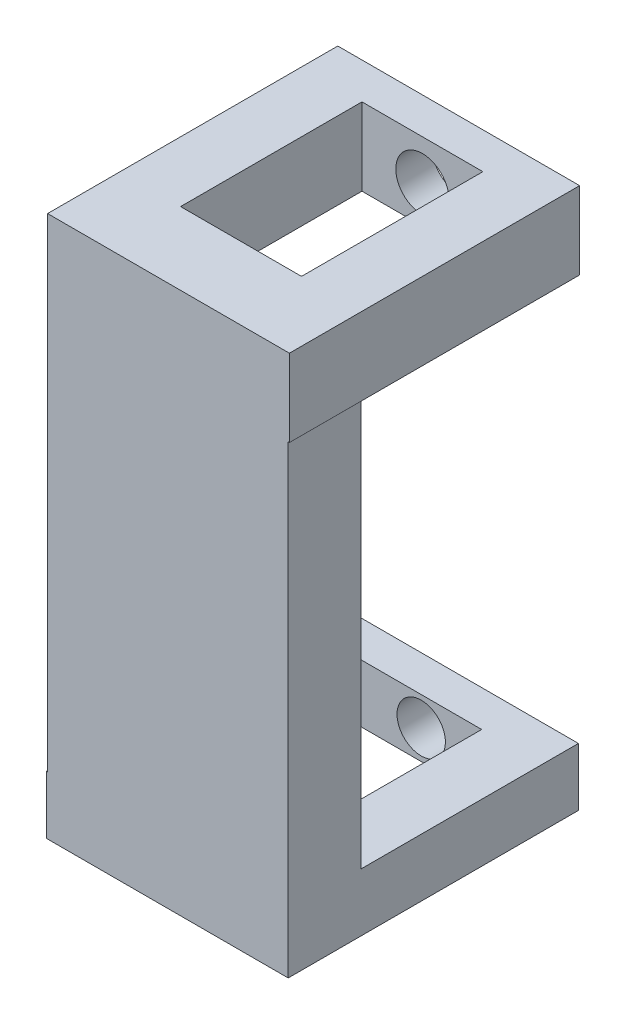
ISO-10303-21;
HEADER;
FILE_DESCRIPTION(('STEP AP214'),'2;1');
FILE_NAME('part.step','',(''),(''),'','','');
FILE_SCHEMA(('AUTOMOTIVE_DESIGN { 1 0 10303 214 1 1 1 1 }'));
ENDSEC;
DATA;
#1=APPLICATION_CONTEXT('core data for automotive mechanical design processes');
#2=APPLICATION_PROTOCOL_DEFINITION('international standard','automotive_design',2000,#1);
#3=PRODUCT_CONTEXT('',#1,'mechanical');
#4=PRODUCT('Part','Part','',(#3));
#5=PRODUCT_RELATED_PRODUCT_CATEGORY('part','',(#4));
#6=PRODUCT_DEFINITION_FORMATION('','',#4);
#7=PRODUCT_DEFINITION_CONTEXT('part definition',#1,'design');
#8=PRODUCT_DEFINITION('design','',#6,#7);
#9=PRODUCT_DEFINITION_SHAPE('','',#8);
#10=(LENGTH_UNIT() NAMED_UNIT(*) SI_UNIT(.MILLI.,.METRE.));
#11=(NAMED_UNIT(*) PLANE_ANGLE_UNIT() SI_UNIT($,.RADIAN.));
#12=(NAMED_UNIT(*) SI_UNIT($,.STERADIAN.) SOLID_ANGLE_UNIT());
#13=UNCERTAINTY_MEASURE_WITH_UNIT(LENGTH_MEASURE(1.E-05),#10,'distance_accuracy_value','');
#14=(GEOMETRIC_REPRESENTATION_CONTEXT(3) GLOBAL_UNCERTAINTY_ASSIGNED_CONTEXT((#13)) GLOBAL_UNIT_ASSIGNED_CONTEXT((#10,
#11,#12)) REPRESENTATION_CONTEXT('',''));
#15=CARTESIAN_POINT('',(0.,0.,0.));
#16=DIRECTION('',(0.,0.,1.));
#17=DIRECTION('',(1.,0.,0.));
#18=AXIS2_PLACEMENT_3D('',#15,#16,#17);
#19=CARTESIAN_POINT('',(-19.9235312164194,-0.0744955401104435,170.832884641977));
#20=DIRECTION('',(1.,0.,0.));
#21=DIRECTION('',(0.,0.,-1.));
#22=AXIS2_PLACEMENT_3D('',#19,#20,#21);
#23=PLANE('',#22);
#24=DIRECTION('',(0.,0.,-1.));
#25=VECTOR('',#24,1.);
#26=CARTESIAN_POINT('',(-19.9235312164194,-20.0742558801104,170.832884641977));
#27=LINE('',#26,#25);
#28=CARTESIAN_POINT('',(-19.9235312164194,-20.0742558801104,170.832884641977));
#29=VERTEX_POINT('',#28);
#30=CARTESIAN_POINT('',(-19.9235312164194,-20.0742558801104,167.832884641977));
#31=VERTEX_POINT('',#30);
#32=EDGE_CURVE('E47',#29,#31,#27,.T.);
#33=ORIENTED_EDGE('',*,*,#32,.F.);
#34=DIRECTION('',(0.,-1.,0.));
#35=VECTOR('',#34,1.);
#36=CARTESIAN_POINT('',(-19.9235312164194,-0.0744955401104435,170.832884641977));
#37=LINE('',#36,#35);
#38=CARTESIAN_POINT('',(-19.9235312164194,-0.0744955401104435,170.832884641977));
#39=VERTEX_POINT('',#38);
#40=EDGE_CURVE('E277',#39,#29,#37,.T.);
#41=ORIENTED_EDGE('',*,*,#40,.F.);
#42=DIRECTION('',(0.,0.,-1.));
#43=VECTOR('',#42,1.);
#44=CARTESIAN_POINT('',(-19.9235312164194,-0.0744955401104435,170.832884641977));
#45=LINE('',#44,#43);
#46=CARTESIAN_POINT('',(-19.9235312164194,-0.0744955401104435,158.832884641977));
#47=VERTEX_POINT('',#46);
#48=EDGE_CURVE('E286',#39,#47,#45,.T.);
#49=ORIENTED_EDGE('',*,*,#48,.T.);
#50=DIRECTION('',(0.,-1.,0.));
#51=VECTOR('',#50,1.);
#52=CARTESIAN_POINT('',(-19.9235312164194,-0.0744955401104435,158.832884641977));
#53=LINE('',#52,#51);
#54=CARTESIAN_POINT('',(-19.9235312164194,-3.27449554011044,158.832884641977));
#55=VERTEX_POINT('',#54);
#56=EDGE_CURVE('E276',#47,#55,#53,.T.);
#57=ORIENTED_EDGE('',*,*,#56,.T.);
#58=DIRECTION('',(0.,0.,-1.));
#59=VECTOR('',#58,1.);
#60=CARTESIAN_POINT('',(-19.9235312164194,-3.27449554011044,170.832884641977));
#61=LINE('',#60,#59);
#62=CARTESIAN_POINT('',(-19.9235312164194,-3.27449554011044,167.832884641977));
#63=VERTEX_POINT('',#62);
#64=EDGE_CURVE('E302',#63,#55,#61,.T.);
#65=ORIENTED_EDGE('',*,*,#64,.F.);
#66=DIRECTION('',(0.,-1.,0.));
#67=VECTOR('',#66,1.);
#68=CARTESIAN_POINT('',(-19.9235312164194,-0.0744955401104435,167.832884641977));
#69=LINE('',#68,#67);
#70=EDGE_CURVE('E224',#63,#31,#69,.T.);
#71=ORIENTED_EDGE('',*,*,#70,.T.);
#72=EDGE_LOOP('',(#33,#41,#49,#57,#65,#71));
#73=FACE_BOUND('',#72,.T.);
#74=ADVANCED_FACE('F33',(#73),#23,.F.);
#75=CARTESIAN_POINT('',(0.,0.,167.832884641977));
#76=DIRECTION('',(0.,0.,1.));
#77=DIRECTION('',(1.,0.,0.));
#78=AXIS2_PLACEMENT_3D('',#75,#76,#77);
#79=PLANE('',#78);
#80=DIRECTION('',(1.,0.,0.));
#81=VECTOR('',#80,1.);
#82=CARTESIAN_POINT('',(0.,-20.0742558801104,167.832884641977));
#83=LINE('',#82,#81);
#84=CARTESIAN_POINT('',(-12.4733202964194,-20.0742558801104,167.832884641977));
#85=VERTEX_POINT('',#84);
#86=CARTESIAN_POINT('',(-9.97332029641936,-20.0742558801104,167.832884641977));
#87=VERTEX_POINT('',#86);
#88=EDGE_CURVE('E11',#85,#87,#83,.T.);
#89=ORIENTED_EDGE('',*,*,#88,.F.);
#90=DIRECTION('',(0.,1.,0.));
#91=VECTOR('',#90,1.);
#92=CARTESIAN_POINT('',(-12.4733202964194,0.,167.832884641977));
#93=LINE('',#92,#91);
#94=CARTESIAN_POINT('',(-12.4733202964194,-22.4742565801104,167.832884641977));
#95=VERTEX_POINT('',#94);
#96=EDGE_CURVE('E219',#95,#85,#93,.T.);
#97=ORIENTED_EDGE('',*,*,#96,.F.);
#98=DIRECTION('',(1.,0.,0.));
#99=VECTOR('',#98,1.);
#100=CARTESIAN_POINT('',(-19.9235312164194,-22.4742565801104,167.832884641977));
#101=LINE('',#100,#99);
#102=CARTESIAN_POINT('',(-17.4733202964194,-22.4742565801104,167.832884641977));
#103=VERTEX_POINT('',#102);
#104=EDGE_CURVE('E226',#103,#95,#101,.T.);
#105=ORIENTED_EDGE('',*,*,#104,.F.);
#106=DIRECTION('',(0.,-1.,0.));
#107=VECTOR('',#106,1.);
#108=CARTESIAN_POINT('',(-17.4733202964194,0.,167.832884641977));
#109=LINE('',#108,#107);
#110=CARTESIAN_POINT('',(-17.4733202964194,-20.0742558801104,167.832884641977));
#111=VERTEX_POINT('',#110);
#112=EDGE_CURVE('E55',#111,#103,#109,.T.);
#113=ORIENTED_EDGE('',*,*,#112,.F.);
#114=EDGE_CURVE('E36',#31,#111,#83,.T.);
#115=ORIENTED_EDGE('',*,*,#114,.F.);
#116=ORIENTED_EDGE('',*,*,#70,.F.);
#117=DIRECTION('',(1.,0.,0.));
#118=VECTOR('',#117,1.);
#119=CARTESIAN_POINT('',(-19.9235312164194,-3.27449554011044,167.832884641977));
#120=LINE('',#119,#118);
#121=CARTESIAN_POINT('',(-17.4235312164194,-3.27449554011044,167.832884641977));
#122=VERTEX_POINT('',#121);
#123=EDGE_CURVE('E240',#63,#122,#120,.T.);
#124=ORIENTED_EDGE('',*,*,#123,.T.);
#125=DIRECTION('',(0.,1.,0.));
#126=VECTOR('',#125,1.);
#127=CARTESIAN_POINT('',(-17.4235312164194,-0.0744955401104441,167.832884641977));
#128=LINE('',#127,#126);
#129=CARTESIAN_POINT('',(-17.4235312164194,-0.0744955401104441,167.832884641977));
#130=VERTEX_POINT('',#129);
#131=EDGE_CURVE('E304',#122,#130,#128,.T.);
#132=ORIENTED_EDGE('',*,*,#131,.T.);
#133=DIRECTION('',(-1.,0.,0.));
#134=VECTOR('',#133,1.);
#135=CARTESIAN_POINT('',(-19.9235312164194,-0.0744955401104435,167.832884641977));
#136=LINE('',#135,#134);
#137=CARTESIAN_POINT('',(-12.4235312164194,-0.0744955401104435,167.832884641977));
#138=VERTEX_POINT('',#137);
#139=EDGE_CURVE('E232',#138,#130,#136,.T.);
#140=ORIENTED_EDGE('',*,*,#139,.F.);
#141=DIRECTION('',(0.,-1.,0.));
#142=VECTOR('',#141,1.);
#143=CARTESIAN_POINT('',(-12.4235312164194,-0.0744955401104435,167.832884641977));
#144=LINE('',#143,#142);
#145=CARTESIAN_POINT('',(-12.4235312164194,-3.27449554011044,167.832884641977));
#146=VERTEX_POINT('',#145);
#147=EDGE_CURVE('E243',#138,#146,#144,.T.);
#148=ORIENTED_EDGE('',*,*,#147,.T.);
#149=CARTESIAN_POINT('',(-9.97332029641936,-3.27449554011044,167.832884641977));
#150=VERTEX_POINT('',#149);
#151=EDGE_CURVE('E244',#146,#150,#120,.T.);
#152=ORIENTED_EDGE('',*,*,#151,.T.);
#153=DIRECTION('',(0.,1.,0.));
#154=VECTOR('',#153,1.);
#155=CARTESIAN_POINT('',(-9.97332029641937,-0.0744955401104435,167.832884641977));
#156=LINE('',#155,#154);
#157=EDGE_CURVE('E230',#87,#150,#156,.T.);
#158=ORIENTED_EDGE('',*,*,#157,.F.);
#159=EDGE_LOOP('',(#89,#97,#105,#113,#115,#116,#124,#132,#140,#148,#152,#158));
#160=FACE_BOUND('',#159,.T.);
#161=ADVANCED_FACE('F308',(#160),#79,.F.);
#162=CARTESIAN_POINT('',(-19.9235312164194,-3.27449554011044,170.832884641977));
#163=DIRECTION('',(0.,1.,0.));
#164=DIRECTION('',(0.,0.,1.));
#165=AXIS2_PLACEMENT_3D('',#162,#163,#164);
#166=PLANE('',#165);
#167=ORIENTED_EDGE('',*,*,#123,.F.);
#168=ORIENTED_EDGE('',*,*,#64,.T.);
#169=DIRECTION('',(1.,0.,0.));
#170=VECTOR('',#169,1.);
#171=CARTESIAN_POINT('',(-19.9235312164194,-3.27449554011044,158.832884641977));
#172=LINE('',#171,#170);
#173=CARTESIAN_POINT('',(-9.92353121641937,-3.27449554011044,158.832884641977));
#174=VERTEX_POINT('',#173);
#175=EDGE_CURVE('E289',#55,#174,#172,.T.);
#176=ORIENTED_EDGE('',*,*,#175,.T.);
#177=DIRECTION('',(0.,0.,-1.));
#178=VECTOR('',#177,1.);
#179=CARTESIAN_POINT('',(-9.92353121641937,-3.27449554011044,170.832884641977));
#180=LINE('',#179,#178);
#181=CARTESIAN_POINT('',(-9.92353121641937,-3.27449554011044,170.832884641977));
#182=VERTEX_POINT('',#181);
#183=EDGE_CURVE('E299',#182,#174,#180,.T.);
#184=ORIENTED_EDGE('',*,*,#183,.F.);
#185=DIRECTION('',(1.,0.,0.));
#186=VECTOR('',#185,1.);
#187=CARTESIAN_POINT('',(-19.9235312164194,-3.27449554011044,170.832884641977));
#188=LINE('',#187,#186);
#189=CARTESIAN_POINT('',(-9.97332029641936,-3.27449554011044,170.832884641977));
#190=VERTEX_POINT('',#189);
#191=EDGE_CURVE('E279',#190,#182,#188,.T.);
#192=ORIENTED_EDGE('',*,*,#191,.F.);
#193=DIRECTION('',(0.,0.,-1.));
#194=VECTOR('',#193,1.);
#195=CARTESIAN_POINT('',(-9.97332029641937,-3.27449554011044,170.832884641977));
#196=LINE('',#195,#194);
#197=EDGE_CURVE('E247',#190,#150,#196,.T.);
#198=ORIENTED_EDGE('',*,*,#197,.T.);
#199=ORIENTED_EDGE('',*,*,#151,.F.);
#200=DIRECTION('',(0.,0.,1.));
#201=VECTOR('',#200,1.);
#202=CARTESIAN_POINT('',(-12.4235312164194,-3.27449554011044,160.332884641977));
#203=LINE('',#202,#201);
#204=CARTESIAN_POINT('',(-12.4235312164194,-3.27449554011044,160.332884641977));
#205=VERTEX_POINT('',#204);
#206=EDGE_CURVE('E262',#205,#146,#203,.T.);
#207=ORIENTED_EDGE('',*,*,#206,.F.);
#208=DIRECTION('',(1.,0.,0.));
#209=VECTOR('',#208,1.);
#210=CARTESIAN_POINT('',(-12.4235312164194,-3.27449554011044,160.332884641977));
#211=LINE('',#210,#209);
#212=CARTESIAN_POINT('',(-17.4235312164194,-3.27449554011044,160.332884641977));
#213=VERTEX_POINT('',#212);
#214=EDGE_CURVE('E258',#213,#205,#211,.T.);
#215=ORIENTED_EDGE('',*,*,#214,.F.);
#216=DIRECTION('',(0.,0.,1.));
#217=VECTOR('',#216,1.);
#218=CARTESIAN_POINT('',(-17.4235312164194,-3.27449554011044,160.332884641977));
#219=LINE('',#218,#217);
#220=EDGE_CURVE('E266',#213,#122,#219,.T.);
#221=ORIENTED_EDGE('',*,*,#220,.T.);
#222=EDGE_LOOP('',(#167,#168,#176,#184,#192,#198,#199,#207,#215,#221));
#223=FACE_BOUND('',#222,.T.);
#224=ADVANCED_FACE('F321',(#223),#166,.F.);
#225=CARTESIAN_POINT('',(-12.4235312164194,-0.0744955401104435,160.332884641977));
#226=DIRECTION('',(1.,0.,0.));
#227=DIRECTION('',(0.,0.,-1.));
#228=AXIS2_PLACEMENT_3D('',#225,#226,#227);
#229=PLANE('',#228);
#230=ORIENTED_EDGE('',*,*,#147,.F.);
#231=DIRECTION('',(0.,0.,1.));
#232=VECTOR('',#231,1.);
#233=CARTESIAN_POINT('',(-12.4235312164194,-0.0744955401104435,160.332884641977));
#234=LINE('',#233,#232);
#235=CARTESIAN_POINT('',(-12.4235312164194,-0.0744955401104435,160.332884641977));
#236=VERTEX_POINT('',#235);
#237=EDGE_CURVE('E261',#236,#138,#234,.T.);
#238=ORIENTED_EDGE('',*,*,#237,.F.);
#239=DIRECTION('',(0.,1.,0.));
#240=VECTOR('',#239,1.);
#241=CARTESIAN_POINT('',(-12.4235312164194,-0.0744955401104435,160.332884641977));
#242=LINE('',#241,#240);
#243=EDGE_CURVE('E250',#205,#236,#242,.T.);
#244=ORIENTED_EDGE('',*,*,#243,.F.);
#245=ORIENTED_EDGE('',*,*,#206,.T.);
#246=EDGE_LOOP('',(#230,#238,#244,#245));
#247=FACE_BOUND('',#246,.T.);
#248=ADVANCED_FACE('F317',(#247),#229,.F.);
#249=CARTESIAN_POINT('',(-17.4235312164194,-0.0744955401104441,160.332884641977));
#250=DIRECTION('',(-1.,0.,0.));
#251=DIRECTION('',(0.,0.,1.));
#252=AXIS2_PLACEMENT_3D('',#249,#250,#251);
#253=PLANE('',#252);
#254=ORIENTED_EDGE('',*,*,#131,.F.);
#255=ORIENTED_EDGE('',*,*,#220,.F.);
#256=DIRECTION('',(0.,-1.,0.));
#257=VECTOR('',#256,1.);
#258=CARTESIAN_POINT('',(-17.4235312164194,-0.0744955401104441,160.332884641977));
#259=LINE('',#258,#257);
#260=CARTESIAN_POINT('',(-17.4235312164194,-0.0744955401104441,160.332884641977));
#261=VERTEX_POINT('',#260);
#262=EDGE_CURVE('E255',#261,#213,#259,.T.);
#263=ORIENTED_EDGE('',*,*,#262,.F.);
#264=DIRECTION('',(0.,0.,1.));
#265=VECTOR('',#264,1.);
#266=CARTESIAN_POINT('',(-17.4235312164194,-0.0744955401104441,160.332884641977));
#267=LINE('',#266,#265);
#268=EDGE_CURVE('E269',#261,#130,#267,.T.);
#269=ORIENTED_EDGE('',*,*,#268,.T.);
#270=EDGE_LOOP('',(#254,#255,#263,#269));
#271=FACE_BOUND('',#270,.T.);
#272=ADVANCED_FACE('F448',(#271),#253,.F.);
#273=CARTESIAN_POINT('',(0.,0.,170.832884641977));
#274=DIRECTION('',(0.,0.,1.));
#275=DIRECTION('',(1.,0.,0.));
#276=AXIS2_PLACEMENT_3D('',#273,#274,#275);
#277=PLANE('',#276);
#278=DIRECTION('',(0.,1.,0.));
#279=VECTOR('',#278,1.);
#280=CARTESIAN_POINT('',(-9.97332029641937,-0.0744955401104435,170.832884641977));
#281=LINE('',#280,#279);
#282=CARTESIAN_POINT('',(-9.97332029641936,-22.4742565801104,170.832884641977));
#283=VERTEX_POINT('',#282);
#284=EDGE_CURVE('E227',#283,#190,#281,.T.);
#285=ORIENTED_EDGE('',*,*,#284,.T.);
#286=ORIENTED_EDGE('',*,*,#191,.T.);
#287=DIRECTION('',(0.,1.,0.));
#288=VECTOR('',#287,1.);
#289=CARTESIAN_POINT('',(-9.92353121641937,-0.0744955401104435,170.832884641977));
#290=LINE('',#289,#288);
#291=CARTESIAN_POINT('',(-9.92353121641937,-0.0744955401104435,170.832884641977));
#292=VERTEX_POINT('',#291);
#293=EDGE_CURVE('E282',#182,#292,#290,.T.);
#294=ORIENTED_EDGE('',*,*,#293,.T.);
#295=DIRECTION('',(-1.,0.,0.));
#296=VECTOR('',#295,1.);
#297=CARTESIAN_POINT('',(-19.9235312164194,-0.0744955401104435,170.832884641977));
#298=LINE('',#297,#296);
#299=EDGE_CURVE('E284',#292,#39,#298,.T.);
#300=ORIENTED_EDGE('',*,*,#299,.T.);
#301=ORIENTED_EDGE('',*,*,#40,.T.);
#302=DIRECTION('',(-1.,0.,0.));
#303=VECTOR('',#302,1.);
#304=CARTESIAN_POINT('',(-19.9733202964194,-20.0742558801104,170.832884641977));
#305=LINE('',#304,#303);
#306=CARTESIAN_POINT('',(-19.9733202964194,-20.0742558801104,170.832884641977));
#307=VERTEX_POINT('',#306);
#308=EDGE_CURVE('E196',#29,#307,#305,.T.);
#309=ORIENTED_EDGE('',*,*,#308,.T.);
#310=DIRECTION('',(0.,-1.,0.));
#311=VECTOR('',#310,1.);
#312=CARTESIAN_POINT('',(-19.9733202964194,-20.0742558801104,170.832884641977));
#313=LINE('',#312,#311);
#314=CARTESIAN_POINT('',(-19.9733202964194,-22.4742565801104,170.832884641977));
#315=VERTEX_POINT('',#314);
#316=EDGE_CURVE('E193',#307,#315,#313,.T.);
#317=ORIENTED_EDGE('',*,*,#316,.T.);
#318=DIRECTION('',(1.,0.,0.));
#319=VECTOR('',#318,1.);
#320=CARTESIAN_POINT('',(-19.9235312164194,-22.4742565801104,170.832884641977));
#321=LINE('',#320,#319);
#322=EDGE_CURVE('E223',#315,#283,#321,.T.);
#323=ORIENTED_EDGE('',*,*,#322,.T.);
#324=EDGE_LOOP('',(#285,#286,#294,#300,#301,#309,#317,#323));
#325=FACE_BOUND('',#324,.T.);
#326=ADVANCED_FACE('F443',(#325),#277,.T.);
#327=CARTESIAN_POINT('',(0.,0.,158.832884641977));
#328=DIRECTION('',(0.,0.,1.));
#329=DIRECTION('',(1.,0.,0.));
#330=AXIS2_PLACEMENT_3D('',#327,#328,#329);
#331=PLANE('',#330);
#332=ORIENTED_EDGE('',*,*,#56,.F.);
#333=DIRECTION('',(-1.,0.,0.));
#334=VECTOR('',#333,1.);
#335=CARTESIAN_POINT('',(-19.9235312164194,-0.0744955401104435,158.832884641977));
#336=LINE('',#335,#334);
#337=CARTESIAN_POINT('',(-9.92353121641937,-0.0744955401104435,158.832884641977));
#338=VERTEX_POINT('',#337);
#339=EDGE_CURVE('E280',#338,#47,#336,.T.);
#340=ORIENTED_EDGE('',*,*,#339,.F.);
#341=DIRECTION('',(0.,1.,0.));
#342=VECTOR('',#341,1.);
#343=CARTESIAN_POINT('',(-9.92353121641937,-0.0744955401104435,158.832884641977));
#344=LINE('',#343,#342);
#345=EDGE_CURVE('E291',#174,#338,#344,.T.);
#346=ORIENTED_EDGE('',*,*,#345,.F.);
#347=ORIENTED_EDGE('',*,*,#175,.F.);
#348=EDGE_LOOP('',(#332,#340,#346,#347));
#349=FACE_BOUND('',#348,.T.);
#350=CARTESIAN_POINT('',(-14.9235312164194,-1.77449554011044,158.832884641977));
#351=DIRECTION('',(0.,0.,1.));
#352=DIRECTION('',(1.,0.,0.));
#353=AXIS2_PLACEMENT_3D('',#350,#351,#352);
#354=CIRCLE('',#353,1.10000033999999);
#355=CARTESIAN_POINT('',(-13.8235308764194,-1.77449554011044,158.832884641977));
#356=VERTEX_POINT('',#355);
#357=EDGE_CURVE('E273',#356,#356,#354,.T.);
#358=ORIENTED_EDGE('',*,*,#357,.T.);
#359=EDGE_LOOP('',(#358));
#360=FACE_BOUND('',#359,.T.);
#361=ADVANCED_FACE('F447',(#349,#360),#331,.F.);
#362=CARTESIAN_POINT('',(-9.92353121641937,-0.0744955401104435,170.832884641977));
#363=DIRECTION('',(-1.,0.,0.));
#364=DIRECTION('',(0.,0.,1.));
#365=AXIS2_PLACEMENT_3D('',#362,#363,#364);
#366=PLANE('',#365);
#367=ORIENTED_EDGE('',*,*,#345,.T.);
#368=DIRECTION('',(0.,0.,-1.));
#369=VECTOR('',#368,1.);
#370=CARTESIAN_POINT('',(-9.92353121641937,-0.0744955401104435,170.832884641977));
#371=LINE('',#370,#369);
#372=EDGE_CURVE('E296',#292,#338,#371,.T.);
#373=ORIENTED_EDGE('',*,*,#372,.F.);
#374=ORIENTED_EDGE('',*,*,#293,.F.);
#375=ORIENTED_EDGE('',*,*,#183,.T.);
#376=EDGE_LOOP('',(#367,#373,#374,#375));
#377=FACE_BOUND('',#376,.T.);
#378=ADVANCED_FACE('F433',(#377),#366,.F.);
#379=CARTESIAN_POINT('',(-19.9235312164194,-0.0744955401104435,170.832884641977));
#380=DIRECTION('',(0.,-1.,0.));
#381=DIRECTION('',(0.,0.,-1.));
#382=AXIS2_PLACEMENT_3D('',#379,#380,#381);
#383=PLANE('',#382);
#384=ORIENTED_EDGE('',*,*,#48,.F.);
#385=ORIENTED_EDGE('',*,*,#299,.F.);
#386=ORIENTED_EDGE('',*,*,#372,.T.);
#387=ORIENTED_EDGE('',*,*,#339,.T.);
#388=EDGE_LOOP('',(#384,#385,#386,#387));
#389=FACE_BOUND('',#388,.T.);
#390=ORIENTED_EDGE('',*,*,#237,.T.);
#391=ORIENTED_EDGE('',*,*,#139,.T.);
#392=ORIENTED_EDGE('',*,*,#268,.F.);
#393=DIRECTION('',(-1.,0.,0.));
#394=VECTOR('',#393,1.);
#395=CARTESIAN_POINT('',(-12.4235312164194,-0.0744955401104435,160.332884641977));
#396=LINE('',#395,#394);
#397=EDGE_CURVE('E252',#236,#261,#396,.T.);
#398=ORIENTED_EDGE('',*,*,#397,.F.);
#399=EDGE_LOOP('',(#390,#391,#392,#398));
#400=FACE_BOUND('',#399,.T.);
#401=ADVANCED_FACE('F313',(#389,#400),#383,.F.);
#402=CARTESIAN_POINT('',(-14.9235312164194,-1.77449554011044,170.832884641977));
#403=DIRECTION('',(0.,0.,-1.));
#404=DIRECTION('',(-1.,0.,0.));
#405=AXIS2_PLACEMENT_3D('',#402,#403,#404);
#406=CYLINDRICAL_SURFACE('',#405,1.10000033999999);
#407=CARTESIAN_POINT('',(-14.9235312164194,-1.77449554011044,160.332884641977));
#408=DIRECTION('',(0.,0.,-1.));
#409=DIRECTION('',(-1.,0.,0.));
#410=AXIS2_PLACEMENT_3D('',#407,#408,#409);
#411=CIRCLE('',#410,1.10000033999999);
#412=CARTESIAN_POINT('',(-16.0235315564194,-1.77449554011044,160.332884641977));
#413=VERTEX_POINT('',#412);
#414=EDGE_CURVE('E265',#413,#413,#411,.T.);
#415=ORIENTED_EDGE('',*,*,#414,.F.);
#416=EDGE_LOOP('',(#415));
#417=FACE_BOUND('',#416,.T.);
#418=ORIENTED_EDGE('',*,*,#357,.F.);
#419=EDGE_LOOP('',(#418));
#420=FACE_BOUND('',#419,.T.);
#421=ADVANCED_FACE('F432',(#417,#420),#406,.F.);
#422=CARTESIAN_POINT('',(0.,0.,160.332884641977));
#423=DIRECTION('',(0.,0.,-1.));
#424=DIRECTION('',(-1.,0.,0.));
#425=AXIS2_PLACEMENT_3D('',#422,#423,#424);
#426=PLANE('',#425);
#427=ORIENTED_EDGE('',*,*,#414,.T.);
#428=EDGE_LOOP('',(#427));
#429=FACE_BOUND('',#428,.T.);
#430=ORIENTED_EDGE('',*,*,#243,.T.);
#431=ORIENTED_EDGE('',*,*,#397,.T.);
#432=ORIENTED_EDGE('',*,*,#262,.T.);
#433=ORIENTED_EDGE('',*,*,#214,.T.);
#434=EDGE_LOOP('',(#430,#431,#432,#433));
#435=FACE_BOUND('',#434,.T.);
#436=ADVANCED_FACE('F349',(#429,#435),#426,.F.);
#437=CARTESIAN_POINT('',(-9.97332029641937,-0.0744955401104435,167.832884641977));
#438=DIRECTION('',(1.,0.,0.));
#439=DIRECTION('',(0.,1.,0.));
#440=AXIS2_PLACEMENT_3D('',#437,#438,#439);
#441=PLANE('',#440);
#442=DIRECTION('',(0.,0.,-1.));
#443=VECTOR('',#442,1.);
#444=CARTESIAN_POINT('',(-9.97332029641936,-20.0742558801104,170.832884641977));
#445=LINE('',#444,#443);
#446=CARTESIAN_POINT('',(-9.97332029641936,-20.0742558801104,158.832884641977));
#447=VERTEX_POINT('',#446);
#448=EDGE_CURVE('E211',#87,#447,#445,.T.);
#449=ORIENTED_EDGE('',*,*,#448,.F.);
#450=ORIENTED_EDGE('',*,*,#157,.T.);
#451=ORIENTED_EDGE('',*,*,#197,.F.);
#452=ORIENTED_EDGE('',*,*,#284,.F.);
#453=DIRECTION('',(0.,0.,1.));
#454=VECTOR('',#453,1.);
#455=CARTESIAN_POINT('',(-9.97332029641936,-22.4742565801104,167.832884641977));
#456=LINE('',#455,#454);
#457=CARTESIAN_POINT('',(-9.97332029641936,-22.4742565801104,158.832884641977));
#458=VERTEX_POINT('',#457);
#459=EDGE_CURVE('E235',#458,#283,#456,.T.);
#460=ORIENTED_EDGE('',*,*,#459,.F.);
#461=DIRECTION('',(0.,1.,0.));
#462=VECTOR('',#461,1.);
#463=CARTESIAN_POINT('',(-9.97332029641936,-20.0742558801104,158.832884641977));
#464=LINE('',#463,#462);
#465=EDGE_CURVE('E205',#458,#447,#464,.T.);
#466=ORIENTED_EDGE('',*,*,#465,.T.);
#467=EDGE_LOOP('',(#449,#450,#451,#452,#460,#466));
#468=FACE_BOUND('',#467,.T.);
#469=ADVANCED_FACE('F329',(#468),#441,.T.);
#470=CARTESIAN_POINT('',(-19.9235312164194,-22.4742565801104,167.832884641977));
#471=DIRECTION('',(0.,-1.,0.));
#472=DIRECTION('',(0.,0.,-1.));
#473=AXIS2_PLACEMENT_3D('',#470,#471,#472);
#474=PLANE('',#473);
#475=ORIENTED_EDGE('',*,*,#322,.F.);
#476=DIRECTION('',(0.,0.,-1.));
#477=VECTOR('',#476,1.);
#478=CARTESIAN_POINT('',(-19.9733202964194,-22.4742565801104,170.832884641977));
#479=LINE('',#478,#477);
#480=CARTESIAN_POINT('',(-19.9733202964194,-22.4742565801104,158.832884641977));
#481=VERTEX_POINT('',#480);
#482=EDGE_CURVE('E213',#315,#481,#479,.T.);
#483=ORIENTED_EDGE('',*,*,#482,.T.);
#484=DIRECTION('',(1.,0.,0.));
#485=VECTOR('',#484,1.);
#486=CARTESIAN_POINT('',(-19.9733202964194,-22.4742565801104,158.832884641977));
#487=LINE('',#486,#485);
#488=EDGE_CURVE('E202',#481,#458,#487,.T.);
#489=ORIENTED_EDGE('',*,*,#488,.T.);
#490=ORIENTED_EDGE('',*,*,#459,.T.);
#491=EDGE_LOOP('',(#475,#483,#489,#490));
#492=FACE_BOUND('',#491,.T.);
#493=ORIENTED_EDGE('',*,*,#104,.T.);
#494=DIRECTION('',(0.,0.,1.));
#495=VECTOR('',#494,1.);
#496=CARTESIAN_POINT('',(-12.4733202964194,-22.4742565801104,160.332884641977));
#497=LINE('',#496,#495);
#498=CARTESIAN_POINT('',(-12.4733202964194,-22.4742565801104,160.332884641977));
#499=VERTEX_POINT('',#498);
#500=EDGE_CURVE('E183',#499,#95,#497,.T.);
#501=ORIENTED_EDGE('',*,*,#500,.F.);
#502=DIRECTION('',(1.,0.,0.));
#503=VECTOR('',#502,1.);
#504=CARTESIAN_POINT('',(-12.4733202964194,-22.4742565801104,160.332884641977));
#505=LINE('',#504,#503);
#506=CARTESIAN_POINT('',(-17.4733202964194,-22.4742565801104,160.332884641977));
#507=VERTEX_POINT('',#506);
#508=EDGE_CURVE('E169',#507,#499,#505,.T.);
#509=ORIENTED_EDGE('',*,*,#508,.F.);
#510=DIRECTION('',(0.,0.,1.));
#511=VECTOR('',#510,1.);
#512=CARTESIAN_POINT('',(-17.4733202964194,-22.4742565801104,160.332884641977));
#513=LINE('',#512,#511);
#514=EDGE_CURVE('E165',#507,#103,#513,.T.);
#515=ORIENTED_EDGE('',*,*,#514,.T.);
#516=EDGE_LOOP('',(#493,#501,#509,#515));
#517=FACE_BOUND('',#516,.T.);
#518=ADVANCED_FACE('F340',(#492,#517),#474,.T.);
#519=CARTESIAN_POINT('',(-19.9733202964194,-20.0742558801104,170.832884641977));
#520=DIRECTION('',(0.,-1.,0.));
#521=DIRECTION('',(0.,0.,-1.));
#522=AXIS2_PLACEMENT_3D('',#519,#520,#521);
#523=PLANE('',#522);
#524=ORIENTED_EDGE('',*,*,#308,.F.);
#525=ORIENTED_EDGE('',*,*,#32,.T.);
#526=ORIENTED_EDGE('',*,*,#114,.T.);
#527=DIRECTION('',(0.,0.,1.));
#528=VECTOR('',#527,1.);
#529=CARTESIAN_POINT('',(-17.4733202964194,-20.0742558801104,160.332884641977));
#530=LINE('',#529,#528);
#531=CARTESIAN_POINT('',(-17.4733202964194,-20.0742558801104,160.332884641977));
#532=VERTEX_POINT('',#531);
#533=EDGE_CURVE('E163',#532,#111,#530,.T.);
#534=ORIENTED_EDGE('',*,*,#533,.F.);
#535=DIRECTION('',(-1.,0.,0.));
#536=VECTOR('',#535,1.);
#537=CARTESIAN_POINT('',(-12.4733202964194,-20.0742558801104,160.332884641977));
#538=LINE('',#537,#536);
#539=CARTESIAN_POINT('',(-12.4733202964194,-20.0742558801104,160.332884641977));
#540=VERTEX_POINT('',#539);
#541=EDGE_CURVE('E170',#540,#532,#538,.T.);
#542=ORIENTED_EDGE('',*,*,#541,.F.);
#543=DIRECTION('',(0.,0.,1.));
#544=VECTOR('',#543,1.);
#545=CARTESIAN_POINT('',(-12.4733202964194,-20.0742558801104,160.332884641977));
#546=LINE('',#545,#544);
#547=EDGE_CURVE('E181',#540,#85,#546,.T.);
#548=ORIENTED_EDGE('',*,*,#547,.T.);
#549=ORIENTED_EDGE('',*,*,#88,.T.);
#550=ORIENTED_EDGE('',*,*,#448,.T.);
#551=DIRECTION('',(-1.,0.,0.));
#552=VECTOR('',#551,1.);
#553=CARTESIAN_POINT('',(-19.9733202964194,-20.0742558801104,158.832884641977));
#554=LINE('',#553,#552);
#555=CARTESIAN_POINT('',(-19.9733202964194,-20.0742558801104,158.832884641977));
#556=VERTEX_POINT('',#555);
#557=EDGE_CURVE('E197',#447,#556,#554,.T.);
#558=ORIENTED_EDGE('',*,*,#557,.T.);
#559=DIRECTION('',(0.,0.,-1.));
#560=VECTOR('',#559,1.);
#561=CARTESIAN_POINT('',(-19.9733202964194,-20.0742558801104,170.832884641977));
#562=LINE('',#561,#560);
#563=EDGE_CURVE('E199',#307,#556,#562,.T.);
#564=ORIENTED_EDGE('',*,*,#563,.F.);
#565=EDGE_LOOP('',(#524,#525,#526,#534,#542,#548,#549,#550,#558,#564));
#566=FACE_BOUND('',#565,.T.);
#567=ADVANCED_FACE('F180',(#566),#523,.F.);
#568=CARTESIAN_POINT('',(-12.4733202964194,-20.0742558801104,160.332884641977));
#569=DIRECTION('',(1.,0.,0.));
#570=DIRECTION('',(0.,0.,-1.));
#571=AXIS2_PLACEMENT_3D('',#568,#569,#570);
#572=PLANE('',#571);
#573=ORIENTED_EDGE('',*,*,#500,.T.);
#574=ORIENTED_EDGE('',*,*,#96,.T.);
#575=ORIENTED_EDGE('',*,*,#547,.F.);
#576=DIRECTION('',(0.,1.,0.));
#577=VECTOR('',#576,1.);
#578=CARTESIAN_POINT('',(-12.4733202964194,-20.0742558801104,160.332884641977));
#579=LINE('',#578,#577);
#580=EDGE_CURVE('E174',#499,#540,#579,.T.);
#581=ORIENTED_EDGE('',*,*,#580,.F.);
#582=EDGE_LOOP('',(#573,#574,#575,#581));
#583=FACE_BOUND('',#582,.T.);
#584=ADVANCED_FACE('F335',(#583),#572,.F.);
#585=CARTESIAN_POINT('',(-17.4733202964194,-20.0742558801104,160.332884641977));
#586=DIRECTION('',(-1.,0.,0.));
#587=DIRECTION('',(0.,0.,1.));
#588=AXIS2_PLACEMENT_3D('',#585,#586,#587);
#589=PLANE('',#588);
#590=ORIENTED_EDGE('',*,*,#533,.T.);
#591=ORIENTED_EDGE('',*,*,#112,.T.);
#592=ORIENTED_EDGE('',*,*,#514,.F.);
#593=DIRECTION('',(0.,-1.,0.));
#594=VECTOR('',#593,1.);
#595=CARTESIAN_POINT('',(-17.4733202964194,-20.0742558801104,160.332884641977));
#596=LINE('',#595,#594);
#597=EDGE_CURVE('E159',#532,#507,#596,.T.);
#598=ORIENTED_EDGE('',*,*,#597,.F.);
#599=EDGE_LOOP('',(#590,#591,#592,#598));
#600=FACE_BOUND('',#599,.T.);
#601=ADVANCED_FACE('F161',(#600),#589,.F.);
#602=CARTESIAN_POINT('',(0.,0.,158.832884641977));
#603=DIRECTION('',(0.,0.,1.));
#604=DIRECTION('',(1.,0.,0.));
#605=AXIS2_PLACEMENT_3D('',#602,#603,#604);
#606=PLANE('',#605);
#607=DIRECTION('',(0.,-1.,0.));
#608=VECTOR('',#607,1.);
#609=CARTESIAN_POINT('',(-19.9733202964194,-20.0742558801104,158.832884641977));
#610=LINE('',#609,#608);
#611=EDGE_CURVE('E191',#556,#481,#610,.T.);
#612=ORIENTED_EDGE('',*,*,#611,.F.);
#613=ORIENTED_EDGE('',*,*,#557,.F.);
#614=ORIENTED_EDGE('',*,*,#465,.F.);
#615=ORIENTED_EDGE('',*,*,#488,.F.);
#616=EDGE_LOOP('',(#612,#613,#614,#615));
#617=FACE_BOUND('',#616,.T.);
#618=CARTESIAN_POINT('',(-14.9733202964194,-21.2742558801104,158.832884641977));
#619=DIRECTION('',(0.,0.,1.));
#620=DIRECTION('',(1.,0.,0.));
#621=AXIS2_PLACEMENT_3D('',#618,#619,#620);
#622=CIRCLE('',#621,1.00000054);
#623=CARTESIAN_POINT('',(-13.9733197564194,-21.2742558801104,158.832884641977));
#624=VERTEX_POINT('',#623);
#625=EDGE_CURVE('E188',#624,#624,#622,.T.);
#626=ORIENTED_EDGE('',*,*,#625,.T.);
#627=EDGE_LOOP('',(#626));
#628=FACE_BOUND('',#627,.T.);
#629=ADVANCED_FACE('F364',(#617,#628),#606,.F.);
#630=CARTESIAN_POINT('',(-19.9733202964194,-20.0742558801104,170.832884641977));
#631=DIRECTION('',(1.,0.,0.));
#632=DIRECTION('',(0.,0.,-1.));
#633=AXIS2_PLACEMENT_3D('',#630,#631,#632);
#634=PLANE('',#633);
#635=ORIENTED_EDGE('',*,*,#611,.T.);
#636=ORIENTED_EDGE('',*,*,#482,.F.);
#637=ORIENTED_EDGE('',*,*,#316,.F.);
#638=ORIENTED_EDGE('',*,*,#563,.T.);
#639=EDGE_LOOP('',(#635,#636,#637,#638));
#640=FACE_BOUND('',#639,.T.);
#641=ADVANCED_FACE('F361',(#640),#634,.F.);
#642=CARTESIAN_POINT('',(-14.9733202964194,-21.2742558801104,170.832884641977));
#643=DIRECTION('',(0.,0.,-1.));
#644=DIRECTION('',(-1.,0.,0.));
#645=AXIS2_PLACEMENT_3D('',#642,#643,#644);
#646=CYLINDRICAL_SURFACE('',#645,1.00000054);
#647=CARTESIAN_POINT('',(-14.9733202964194,-21.2742558801104,160.332884641977));
#648=DIRECTION('',(0.,0.,-1.));
#649=DIRECTION('',(-1.,0.,0.));
#650=AXIS2_PLACEMENT_3D('',#647,#648,#649);
#651=CIRCLE('',#650,1.00000054);
#652=CARTESIAN_POINT('',(-15.9733208364194,-21.2742558801104,160.332884641977));
#653=VERTEX_POINT('',#652);
#654=EDGE_CURVE('E192',#653,#653,#651,.T.);
#655=ORIENTED_EDGE('',*,*,#654,.F.);
#656=EDGE_LOOP('',(#655));
#657=FACE_BOUND('',#656,.T.);
#658=ORIENTED_EDGE('',*,*,#625,.F.);
#659=EDGE_LOOP('',(#658));
#660=FACE_BOUND('',#659,.T.);
#661=ADVANCED_FACE('F363',(#657,#660),#646,.F.);
#662=CARTESIAN_POINT('',(0.,0.,160.332884641977));
#663=DIRECTION('',(0.,0.,-1.));
#664=DIRECTION('',(-1.,0.,0.));
#665=AXIS2_PLACEMENT_3D('',#662,#663,#664);
#666=PLANE('',#665);
#667=ORIENTED_EDGE('',*,*,#654,.T.);
#668=EDGE_LOOP('',(#667));
#669=FACE_BOUND('',#668,.T.);
#670=ORIENTED_EDGE('',*,*,#580,.T.);
#671=ORIENTED_EDGE('',*,*,#541,.T.);
#672=ORIENTED_EDGE('',*,*,#597,.T.);
#673=ORIENTED_EDGE('',*,*,#508,.T.);
#674=EDGE_LOOP('',(#670,#671,#672,#673));
#675=FACE_BOUND('',#674,.T.);
#676=ADVANCED_FACE('F173',(#669,#675),#666,.F.);
#677=CLOSED_SHELL('',(#74,#161,#224,#248,#272,#326,#361,#378,#401,#421,#436,#469,#518,#567,#584,
#601,#629,#641,#661,#676));
#678=MANIFOLD_SOLID_BREP('B2',#677);
#679=ADVANCED_BREP_SHAPE_REPRESENTATION('',(#18,#678),#14);
#680=SHAPE_DEFINITION_REPRESENTATION(#9,#679);
ENDSEC;
END-ISO-10303-21;
